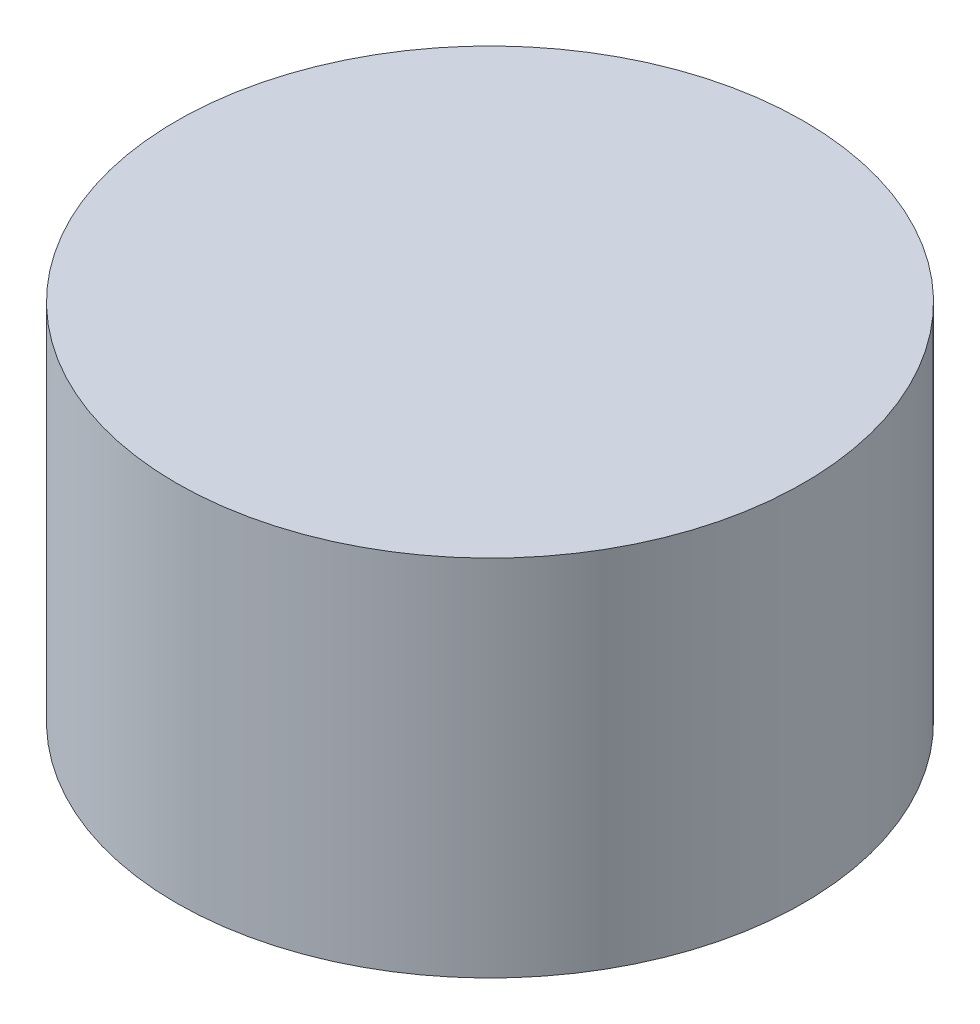
ISO-10303-21;
HEADER;
FILE_DESCRIPTION(('STEP AP214'),'2;1');
FILE_NAME('part.step','',(''),(''),'','','');
FILE_SCHEMA(('AUTOMOTIVE_DESIGN { 1 0 10303 214 1 1 1 1 }'));
ENDSEC;
DATA;
#1=APPLICATION_CONTEXT('core data for automotive mechanical design processes');
#2=APPLICATION_PROTOCOL_DEFINITION('international standard','automotive_design',2000,#1);
#3=PRODUCT_CONTEXT('',#1,'mechanical');
#4=PRODUCT('Part','Part','',(#3));
#5=PRODUCT_RELATED_PRODUCT_CATEGORY('part','',(#4));
#6=PRODUCT_DEFINITION_FORMATION('','',#4);
#7=PRODUCT_DEFINITION_CONTEXT('part definition',#1,'design');
#8=PRODUCT_DEFINITION('design','',#6,#7);
#9=PRODUCT_DEFINITION_SHAPE('','',#8);
#10=(LENGTH_UNIT() NAMED_UNIT(*) SI_UNIT(.MILLI.,.METRE.));
#11=(NAMED_UNIT(*) PLANE_ANGLE_UNIT() SI_UNIT($,.RADIAN.));
#12=(NAMED_UNIT(*) SI_UNIT($,.STERADIAN.) SOLID_ANGLE_UNIT());
#13=UNCERTAINTY_MEASURE_WITH_UNIT(LENGTH_MEASURE(1.E-05),#10,'distance_accuracy_value','');
#14=(GEOMETRIC_REPRESENTATION_CONTEXT(3) GLOBAL_UNCERTAINTY_ASSIGNED_CONTEXT((#13)) GLOBAL_UNIT_ASSIGNED_CONTEXT((#10,
#11,#12)) REPRESENTATION_CONTEXT('',''));
#15=CARTESIAN_POINT('',(0.,0.,0.));
#16=DIRECTION('',(0.,0.,1.));
#17=DIRECTION('',(1.,0.,0.));
#18=AXIS2_PLACEMENT_3D('',#15,#16,#17);
#19=CARTESIAN_POINT('',(0.,20.,0.));
#20=DIRECTION('',(0.,-1.,0.));
#21=DIRECTION('',(0.,0.,-1.));
#22=AXIS2_PLACEMENT_3D('',#19,#20,#21);
#23=CYLINDRICAL_SURFACE('',#22,17.25);
#24=CARTESIAN_POINT('',(0.,20.,0.));
#25=DIRECTION('',(0.,1.,0.));
#26=DIRECTION('',(0.,0.,1.));
#27=AXIS2_PLACEMENT_3D('',#24,#25,#26);
#28=CIRCLE('',#27,17.25);
#29=CARTESIAN_POINT('',(0.,20.,17.25));
#30=VERTEX_POINT('',#29);
#31=EDGE_CURVE('E10',#30,#30,#28,.T.);
#32=ORIENTED_EDGE('',*,*,#31,.F.);
#33=EDGE_LOOP('',(#32));
#34=FACE_BOUND('',#33,.T.);
#35=CARTESIAN_POINT('',(0.,0.,0.));
#36=DIRECTION('',(0.,1.,0.));
#37=DIRECTION('',(0.,0.,1.));
#38=AXIS2_PLACEMENT_3D('',#35,#36,#37);
#39=CIRCLE('',#38,17.25);
#40=CARTESIAN_POINT('',(0.,0.,17.25));
#41=VERTEX_POINT('',#40);
#42=EDGE_CURVE('E36',#41,#41,#39,.T.);
#43=ORIENTED_EDGE('',*,*,#42,.T.);
#44=EDGE_LOOP('',(#43));
#45=FACE_BOUND('',#44,.T.);
#46=ADVANCED_FACE('F33',(#34,#45),#23,.T.);
#47=CARTESIAN_POINT('',(0.,20.,0.));
#48=DIRECTION('',(0.,1.,0.));
#49=DIRECTION('',(0.,0.,1.));
#50=AXIS2_PLACEMENT_3D('',#47,#48,#49);
#51=PLANE('',#50);
#52=ORIENTED_EDGE('',*,*,#31,.T.);
#53=EDGE_LOOP('',(#52));
#54=FACE_BOUND('',#53,.T.);
#55=ADVANCED_FACE('F48',(#54),#51,.T.);
#56=CARTESIAN_POINT('',(0.,0.,0.));
#57=DIRECTION('',(0.,1.,0.));
#58=DIRECTION('',(0.,0.,1.));
#59=AXIS2_PLACEMENT_3D('',#56,#57,#58);
#60=PLANE('',#59);
#61=ORIENTED_EDGE('',*,*,#42,.F.);
#62=EDGE_LOOP('',(#61));
#63=FACE_BOUND('',#62,.T.);
#64=ADVANCED_FACE('F46',(#63),#60,.F.);
#65=CLOSED_SHELL('',(#46,#55,#64));
#66=MANIFOLD_SOLID_BREP('B2',#65);
#67=ADVANCED_BREP_SHAPE_REPRESENTATION('',(#18,#66),#14);
#68=SHAPE_DEFINITION_REPRESENTATION(#9,#67);
ENDSEC;
END-ISO-10303-21;
